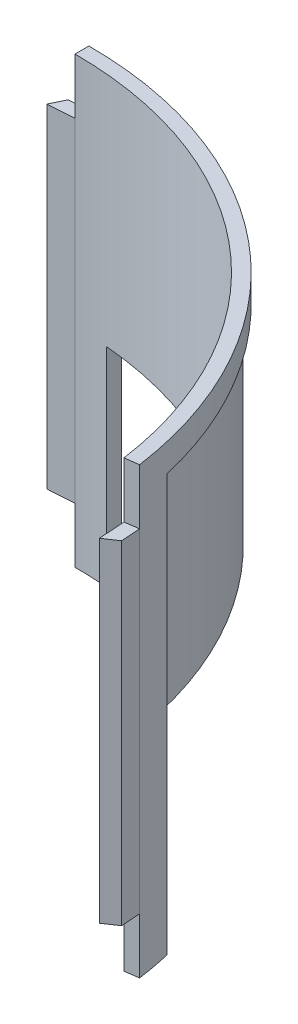
ISO-10303-21;
HEADER;
FILE_DESCRIPTION(('STEP AP214'),'2;1');
FILE_NAME('part.step','',(''),(''),'','','');
FILE_SCHEMA(('AUTOMOTIVE_DESIGN { 1 0 10303 214 1 1 1 1 }'));
ENDSEC;
DATA;
#1=APPLICATION_CONTEXT('core data for automotive mechanical design processes');
#2=APPLICATION_PROTOCOL_DEFINITION('international standard','automotive_design',2000,#1);
#3=PRODUCT_CONTEXT('',#1,'mechanical');
#4=PRODUCT('Part','Part','',(#3));
#5=PRODUCT_RELATED_PRODUCT_CATEGORY('part','',(#4));
#6=PRODUCT_DEFINITION_FORMATION('','',#4);
#7=PRODUCT_DEFINITION_CONTEXT('part definition',#1,'design');
#8=PRODUCT_DEFINITION('design','',#6,#7);
#9=PRODUCT_DEFINITION_SHAPE('','',#8);
#10=(LENGTH_UNIT() NAMED_UNIT(*) SI_UNIT(.MILLI.,.METRE.));
#11=(NAMED_UNIT(*) PLANE_ANGLE_UNIT() SI_UNIT($,.RADIAN.));
#12=(NAMED_UNIT(*) SI_UNIT($,.STERADIAN.) SOLID_ANGLE_UNIT());
#13=UNCERTAINTY_MEASURE_WITH_UNIT(LENGTH_MEASURE(1.E-05),#10,'distance_accuracy_value','');
#14=(GEOMETRIC_REPRESENTATION_CONTEXT(3) GLOBAL_UNCERTAINTY_ASSIGNED_CONTEXT((#13)) GLOBAL_UNIT_ASSIGNED_CONTEXT((#10,
#11,#12)) REPRESENTATION_CONTEXT('',''));
#15=CARTESIAN_POINT('',(0.,0.,0.));
#16=DIRECTION('',(0.,0.,1.));
#17=DIRECTION('',(1.,0.,0.));
#18=AXIS2_PLACEMENT_3D('',#15,#16,#17);
#19=CARTESIAN_POINT('',(0.,0.,0.));
#20=DIRECTION('',(0.,-1.,0.));
#21=DIRECTION('',(0.,0.,-1.));
#22=AXIS2_PLACEMENT_3D('',#19,#20,#21);
#23=PLANE('',#22);
#24=DIRECTION('',(0.0866014517586422,0.,-0.996243036890746));
#25=VECTOR('',#24,1.);
#26=CARTESIAN_POINT('',(61.0540234898431,0.,-702.351341007976));
#27=LINE('',#26,#25);
#28=CARTESIAN_POINT('',(58.888987195877,0.,-677.445265085707));
#29=VERTEX_POINT('',#28);
#30=CARTESIAN_POINT('',(61.0540234898431,0.,-702.351341007976));
#31=VERTEX_POINT('',#30);
#32=EDGE_CURVE('E306',#29,#31,#27,.T.);
#33=ORIENTED_EDGE('',*,*,#32,.F.);
#34=CARTESIAN_POINT('',(0.,0.,0.));
#35=DIRECTION('',(0.,-1.,0.));
#36=DIRECTION('',(0.,0.,-1.));
#37=AXIS2_PLACEMENT_3D('',#34,#35,#36);
#38=CIRCLE('',#37,680.);
#39=CARTESIAN_POINT('',(0.,0.,-680.));
#40=VERTEX_POINT('',#39);
#41=EDGE_CURVE('E277',#40,#29,#38,.T.);
#42=ORIENTED_EDGE('',*,*,#41,.F.);
#43=DIRECTION('',(0.,0.,1.));
#44=VECTOR('',#43,1.);
#45=CARTESIAN_POINT('',(0.,0.,-705.));
#46=LINE('',#45,#44);
#47=CARTESIAN_POINT('',(0.,0.,-705.));
#48=VERTEX_POINT('',#47);
#49=EDGE_CURVE('E273',#48,#40,#46,.T.);
#50=ORIENTED_EDGE('',*,*,#49,.F.);
#51=CARTESIAN_POINT('',(0.,0.,0.));
#52=DIRECTION('',(0.,1.,0.));
#53=DIRECTION('',(0.,0.,-1.));
#54=AXIS2_PLACEMENT_3D('',#51,#52,#53);
#55=CIRCLE('',#54,705.);
#56=EDGE_CURVE('E253',#31,#48,#55,.T.);
#57=ORIENTED_EDGE('',*,*,#56,.F.);
#58=EDGE_LOOP('',(#33,#42,#50,#57));
#59=FACE_BOUND('',#58,.T.);
#60=ADVANCED_FACE('F36',(#59),#23,.T.);
#61=CARTESIAN_POINT('',(0.,800.,-705.));
#62=DIRECTION('',(1.,0.,0.));
#63=DIRECTION('',(0.,0.,-1.));
#64=AXIS2_PLACEMENT_3D('',#61,#62,#63);
#65=PLANE('',#64);
#66=DIRECTION('',(0.,0.,-1.));
#67=VECTOR('',#66,1.);
#68=CARTESIAN_POINT('',(-1.67579190573702E-13,700.,-1.45674367899697E-13));
#69=LINE('',#68,#67);
#70=CARTESIAN_POINT('',(0.,700.,-680.));
#71=VERTEX_POINT('',#70);
#72=CARTESIAN_POINT('',(0.,700.,-705.));
#73=VERTEX_POINT('',#72);
#74=EDGE_CURVE('E188',#71,#73,#69,.T.);
#75=ORIENTED_EDGE('',*,*,#74,.F.);
#76=DIRECTION('',(0.,-1.,0.));
#77=VECTOR('',#76,1.);
#78=CARTESIAN_POINT('',(0.,800.,-680.));
#79=LINE('',#78,#77);
#80=CARTESIAN_POINT('',(0.,800.,-680.));
#81=VERTEX_POINT('',#80);
#82=EDGE_CURVE('E289',#81,#71,#79,.T.);
#83=ORIENTED_EDGE('',*,*,#82,.F.);
#84=DIRECTION('',(0.,0.,1.));
#85=VECTOR('',#84,1.);
#86=CARTESIAN_POINT('',(0.,800.,-705.));
#87=LINE('',#86,#85);
#88=CARTESIAN_POINT('',(0.,800.,-705.));
#89=VERTEX_POINT('',#88);
#90=EDGE_CURVE('E262',#89,#81,#87,.T.);
#91=ORIENTED_EDGE('',*,*,#90,.F.);
#92=DIRECTION('',(0.,-1.,0.));
#93=VECTOR('',#92,1.);
#94=CARTESIAN_POINT('',(0.,800.,-705.));
#95=LINE('',#94,#93);
#96=EDGE_CURVE('E11',#89,#73,#95,.T.);
#97=ORIENTED_EDGE('',*,*,#96,.T.);
#98=EDGE_LOOP('',(#75,#83,#91,#97));
#99=FACE_BOUND('',#98,.T.);
#100=ADVANCED_FACE('F359',(#99),#65,.F.);
#101=CARTESIAN_POINT('',(698.138988462807,800.,-98.1170361768489));
#102=DIRECTION('',(-0.139173100960069,0.,-0.99026806874157));
#103=DIRECTION('',(-0.99026806874157,0.,0.139173100960069));
#104=AXIS2_PLACEMENT_3D('',#101,#102,#103);
#105=PLANE('',#104);
#106=DIRECTION('',(0.99026806874157,0.,-0.13917310096007));
#107=VECTOR('',#106,1.);
#108=CARTESIAN_POINT('',(0.,700.,0.));
#109=LINE('',#108,#107);
#110=CARTESIAN_POINT('',(673.382286744267,700.,-94.6377086528472));
#111=VERTEX_POINT('',#110);
#112=CARTESIAN_POINT('',(698.138988462806,700.,-98.1170361768489));
#113=VERTEX_POINT('',#112);
#114=EDGE_CURVE('E213',#111,#113,#109,.T.);
#115=ORIENTED_EDGE('',*,*,#114,.T.);
#116=DIRECTION('',(0.,-1.,0.));
#117=VECTOR('',#116,1.);
#118=CARTESIAN_POINT('',(698.138988462807,800.,-98.1170361768489));
#119=LINE('',#118,#117);
#120=CARTESIAN_POINT('',(698.138988462807,800.,-98.1170361768489));
#121=VERTEX_POINT('',#120);
#122=EDGE_CURVE('E282',#121,#113,#119,.T.);
#123=ORIENTED_EDGE('',*,*,#122,.F.);
#124=DIRECTION('',(0.99026806874157,0.,-0.139173100960069));
#125=VECTOR('',#124,1.);
#126=CARTESIAN_POINT('',(698.138988462807,800.,-98.1170361768489));
#127=LINE('',#126,#125);
#128=CARTESIAN_POINT('',(673.382286744267,800.,-94.6377086528472));
#129=VERTEX_POINT('',#128);
#130=EDGE_CURVE('E267',#129,#121,#127,.T.);
#131=ORIENTED_EDGE('',*,*,#130,.F.);
#132=DIRECTION('',(0.,-1.,0.));
#133=VECTOR('',#132,1.);
#134=CARTESIAN_POINT('',(673.382286744267,800.,-94.6377086528472));
#135=LINE('',#134,#133);
#136=EDGE_CURVE('E286',#129,#111,#135,.T.);
#137=ORIENTED_EDGE('',*,*,#136,.T.);
#138=EDGE_LOOP('',(#115,#123,#131,#137));
#139=FACE_BOUND('',#138,.T.);
#140=ADVANCED_FACE('F352',(#139),#105,.F.);
#141=DIRECTION('',(0.99026806874157,0.,-0.13917310096007));
#142=VECTOR('',#141,1.);
#143=CARTESIAN_POINT('',(0.,100.,0.));
#144=LINE('',#143,#142);
#145=CARTESIAN_POINT('',(673.382286744267,100.,-94.6377086528472));
#146=VERTEX_POINT('',#145);
#147=CARTESIAN_POINT('',(698.138988462806,100.,-98.1170361768489));
#148=VERTEX_POINT('',#147);
#149=EDGE_CURVE('E59',#146,#148,#144,.T.);
#150=ORIENTED_EDGE('',*,*,#149,.F.);
#151=CARTESIAN_POINT('',(673.382286744267,0.,-94.6377086528472));
#152=VERTEX_POINT('',#151);
#153=EDGE_CURVE('E285',#146,#152,#135,.T.);
#154=ORIENTED_EDGE('',*,*,#153,.T.);
#155=DIRECTION('',(0.99026806874157,0.,-0.139173100960069));
#156=VECTOR('',#155,1.);
#157=CARTESIAN_POINT('',(698.138988462807,0.,-98.1170361768489));
#158=LINE('',#157,#156);
#159=CARTESIAN_POINT('',(698.138988462807,0.,-98.1170361768489));
#160=VERTEX_POINT('',#159);
#161=EDGE_CURVE('E263',#152,#160,#158,.T.);
#162=ORIENTED_EDGE('',*,*,#161,.T.);
#163=EDGE_CURVE('E269',#148,#160,#119,.T.);
#164=ORIENTED_EDGE('',*,*,#163,.F.);
#165=EDGE_LOOP('',(#150,#154,#162,#164));
#166=FACE_BOUND('',#165,.T.);
#167=ADVANCED_FACE('F334',(#166),#105,.F.);
#168=CARTESIAN_POINT('',(0.,800.,0.));
#169=DIRECTION('',(0.,-1.,0.));
#170=DIRECTION('',(0.,0.,-1.));
#171=AXIS2_PLACEMENT_3D('',#168,#169,#170);
#172=CYLINDRICAL_SURFACE('',#171,705.);
#173=CARTESIAN_POINT('',(687.019028262849,0.,-158.208264021733));
#174=VERTEX_POINT('',#173);
#175=EDGE_CURVE('E270',#160,#174,#55,.T.);
#176=ORIENTED_EDGE('',*,*,#175,.T.);
#177=DIRECTION('',(0.,-1.,0.));
#178=VECTOR('',#177,1.);
#179=CARTESIAN_POINT('',(687.019028262849,750.,-158.208264021733));
#180=LINE('',#179,#178);
#181=CARTESIAN_POINT('',(687.019028262849,750.,-158.208264021733));
#182=VERTEX_POINT('',#181);
#183=EDGE_CURVE('E189',#182,#174,#180,.T.);
#184=ORIENTED_EDGE('',*,*,#183,.F.);
#185=CARTESIAN_POINT('',(0.,750.,0.));
#186=DIRECTION('',(0.,-1.,0.));
#187=DIRECTION('',(0.,0.,-1.));
#188=AXIS2_PLACEMENT_3D('',#185,#186,#187);
#189=CIRCLE('',#188,705.);
#190=CARTESIAN_POINT('',(61.0540234898431,750.,-702.351341007976));
#191=VERTEX_POINT('',#190);
#192=EDGE_CURVE('E320',#191,#182,#189,.T.);
#193=ORIENTED_EDGE('',*,*,#192,.F.);
#194=DIRECTION('',(0.,-1.,0.));
#195=VECTOR('',#194,1.);
#196=CARTESIAN_POINT('',(61.0540234898431,750.,-702.351341007976));
#197=LINE('',#196,#195);
#198=EDGE_CURVE('E194',#191,#31,#197,.T.);
#199=ORIENTED_EDGE('',*,*,#198,.T.);
#200=ORIENTED_EDGE('',*,*,#56,.T.);
#201=CARTESIAN_POINT('',(0.,100.,-705.));
#202=VERTEX_POINT('',#201);
#203=EDGE_CURVE('E44',#202,#48,#95,.T.);
#204=ORIENTED_EDGE('',*,*,#203,.F.);
#205=DIRECTION('',(0.,1.,0.));
#206=VECTOR('',#205,1.);
#207=CARTESIAN_POINT('',(2.35922392732846E-13,100.,-705.));
#208=LINE('',#207,#206);
#209=EDGE_CURVE('E233',#202,#73,#208,.T.);
#210=ORIENTED_EDGE('',*,*,#209,.T.);
#211=ORIENTED_EDGE('',*,*,#96,.F.);
#212=CARTESIAN_POINT('',(0.,800.,0.));
#213=DIRECTION('',(0.,1.,0.));
#214=DIRECTION('',(0.,0.,-1.));
#215=AXIS2_PLACEMENT_3D('',#212,#213,#214);
#216=CIRCLE('',#215,705.);
#217=EDGE_CURVE('E259',#121,#89,#216,.T.);
#218=ORIENTED_EDGE('',*,*,#217,.F.);
#219=ORIENTED_EDGE('',*,*,#122,.T.);
#220=DIRECTION('',(0.,1.,0.));
#221=VECTOR('',#220,1.);
#222=CARTESIAN_POINT('',(698.138988462806,100.,-98.1170361768489));
#223=LINE('',#222,#221);
#224=EDGE_CURVE('E251',#148,#113,#223,.T.);
#225=ORIENTED_EDGE('',*,*,#224,.F.);
#226=ORIENTED_EDGE('',*,*,#163,.T.);
#227=EDGE_LOOP('',(#176,#184,#193,#199,#200,#204,#210,#211,#218,#219,#225,#226));
#228=FACE_BOUND('',#227,.T.);
#229=ADVANCED_FACE('F38',(#228),#172,.T.);
#230=CARTESIAN_POINT('',(1.94289029309402E-13,100.,-680.));
#231=VERTEX_POINT('',#230);
#232=EDGE_CURVE('E288',#231,#40,#79,.T.);
#233=ORIENTED_EDGE('',*,*,#232,.F.);
#234=DIRECTION('',(0.,0.,-1.));
#235=VECTOR('',#234,1.);
#236=CARTESIAN_POINT('',(0.,100.,0.));
#237=LINE('',#236,#235);
#238=EDGE_CURVE('E225',#231,#202,#237,.T.);
#239=ORIENTED_EDGE('',*,*,#238,.T.);
#240=ORIENTED_EDGE('',*,*,#203,.T.);
#241=ORIENTED_EDGE('',*,*,#49,.T.);
#242=EDGE_LOOP('',(#233,#239,#240,#241));
#243=FACE_BOUND('',#242,.T.);
#244=ADVANCED_FACE('F302',(#243),#65,.F.);
#245=CARTESIAN_POINT('',(0.,800.,0.));
#246=DIRECTION('',(0.,-1.,0.));
#247=DIRECTION('',(0.,0.,-1.));
#248=AXIS2_PLACEMENT_3D('',#245,#246,#247);
#249=CYLINDRICAL_SURFACE('',#248,680.);
#250=ORIENTED_EDGE('',*,*,#41,.T.);
#251=DIRECTION('',(0.,-1.,0.));
#252=VECTOR('',#251,1.);
#253=CARTESIAN_POINT('',(58.888987195877,375.,-677.445265085707));
#254=LINE('',#253,#252);
#255=CARTESIAN_POINT('',(58.888987195877,375.,-677.445265085707));
#256=VERTEX_POINT('',#255);
#257=EDGE_CURVE('E309',#256,#29,#254,.T.);
#258=ORIENTED_EDGE('',*,*,#257,.F.);
#259=CARTESIAN_POINT('',(0.,375.,0.));
#260=DIRECTION('',(0.,1.,0.));
#261=DIRECTION('',(0.,0.,-1.));
#262=AXIS2_PLACEMENT_3D('',#259,#260,#261);
#263=CIRCLE('',#262,680.);
#264=CARTESIAN_POINT('',(662.656651374096,375.,-152.598041893302));
#265=VERTEX_POINT('',#264);
#266=EDGE_CURVE('E174',#265,#256,#263,.T.);
#267=ORIENTED_EDGE('',*,*,#266,.F.);
#268=DIRECTION('',(0.,-1.,0.));
#269=VECTOR('',#268,1.);
#270=CARTESIAN_POINT('',(662.656651374096,375.,-152.598041893302));
#271=LINE('',#270,#269);
#272=CARTESIAN_POINT('',(662.656651374096,0.,-152.598041893302));
#273=VERTEX_POINT('',#272);
#274=EDGE_CURVE('E171',#265,#273,#271,.T.);
#275=ORIENTED_EDGE('',*,*,#274,.T.);
#276=EDGE_CURVE('E276',#273,#152,#38,.T.);
#277=ORIENTED_EDGE('',*,*,#276,.T.);
#278=ORIENTED_EDGE('',*,*,#153,.F.);
#279=DIRECTION('',(0.,1.,0.));
#280=VECTOR('',#279,1.);
#281=CARTESIAN_POINT('',(673.382286744267,100.,-94.6377086528472));
#282=LINE('',#281,#280);
#283=EDGE_CURVE('E250',#146,#111,#282,.T.);
#284=ORIENTED_EDGE('',*,*,#283,.T.);
#285=ORIENTED_EDGE('',*,*,#136,.F.);
#286=CARTESIAN_POINT('',(0.,800.,0.));
#287=DIRECTION('',(0.,-1.,0.));
#288=DIRECTION('',(0.,0.,-1.));
#289=AXIS2_PLACEMENT_3D('',#286,#287,#288);
#290=CIRCLE('',#289,680.);
#291=EDGE_CURVE('E265',#81,#129,#290,.T.);
#292=ORIENTED_EDGE('',*,*,#291,.F.);
#293=ORIENTED_EDGE('',*,*,#82,.T.);
#294=DIRECTION('',(0.,1.,0.));
#295=VECTOR('',#294,1.);
#296=CARTESIAN_POINT('',(1.94289029309402E-13,100.,-680.));
#297=LINE('',#296,#295);
#298=EDGE_CURVE('E234',#231,#71,#297,.T.);
#299=ORIENTED_EDGE('',*,*,#298,.F.);
#300=ORIENTED_EDGE('',*,*,#232,.T.);
#301=EDGE_LOOP('',(#250,#258,#267,#275,#277,#278,#284,#285,#292,#293,#299,#300));
#302=FACE_BOUND('',#301,.T.);
#303=ADVANCED_FACE('F297',(#302),#249,.F.);
#304=CARTESIAN_POINT('',(0.,800.,0.));
#305=DIRECTION('',(0.,-1.,0.));
#306=DIRECTION('',(0.,0.,-1.));
#307=AXIS2_PLACEMENT_3D('',#304,#305,#306);
#308=PLANE('',#307);
#309=ORIENTED_EDGE('',*,*,#217,.T.);
#310=ORIENTED_EDGE('',*,*,#90,.T.);
#311=ORIENTED_EDGE('',*,*,#291,.T.);
#312=ORIENTED_EDGE('',*,*,#130,.T.);
#313=EDGE_LOOP('',(#309,#310,#311,#312));
#314=FACE_BOUND('',#313,.T.);
#315=ADVANCED_FACE('F355',(#314),#308,.F.);
#316=ORIENTED_EDGE('',*,*,#276,.F.);
#317=DIRECTION('',(-0.974495075550141,0.,0.224408885137209));
#318=VECTOR('',#317,1.);
#319=CARTESIAN_POINT('',(677.274077507348,0.,-155.964175170361));
#320=LINE('',#319,#318);
#321=EDGE_CURVE('E197',#174,#273,#320,.T.);
#322=ORIENTED_EDGE('',*,*,#321,.F.);
#323=ORIENTED_EDGE('',*,*,#175,.F.);
#324=ORIENTED_EDGE('',*,*,#161,.F.);
#325=EDGE_LOOP('',(#316,#322,#323,#324));
#326=FACE_BOUND('',#325,.T.);
#327=ADVANCED_FACE('F332',(#326),#23,.T.);
#328=CARTESIAN_POINT('',(701.569494231403,100.,-49.0585180884084));
#329=DIRECTION('',(-0.997564050259826,0.,0.0697564737441046));
#330=DIRECTION('',(0.0697564737441046,0.,0.997564050259826));
#331=AXIS2_PLACEMENT_3D('',#328,#329,#330);
#332=PLANE('',#331);
#333=ORIENTED_EDGE('',*,*,#224,.T.);
#334=DIRECTION('',(0.0697564737441046,0.,0.997564050259826));
#335=VECTOR('',#334,1.);
#336=CARTESIAN_POINT('',(701.569494231403,700.,-49.0585180884084));
#337=LINE('',#336,#335);
#338=CARTESIAN_POINT('',(700.565098890112,700.,-63.4220406540098));
#339=VERTEX_POINT('',#338);
#340=EDGE_CURVE('E216',#113,#339,#337,.T.);
#341=ORIENTED_EDGE('',*,*,#340,.T.);
#342=DIRECTION('',(0.,1.,0.));
#343=VECTOR('',#342,1.);
#344=CARTESIAN_POINT('',(700.565098890112,100.,-63.4220406540098));
#345=LINE('',#344,#343);
#346=CARTESIAN_POINT('',(700.565098890112,100.,-63.4220406540098));
#347=VERTEX_POINT('',#346);
#348=EDGE_CURVE('E254',#347,#339,#345,.T.);
#349=ORIENTED_EDGE('',*,*,#348,.F.);
#350=DIRECTION('',(0.0697564737441046,0.,0.997564050259826));
#351=VECTOR('',#350,1.);
#352=CARTESIAN_POINT('',(701.569494231403,100.,-49.0585180884084));
#353=LINE('',#352,#351);
#354=EDGE_CURVE('E248',#148,#347,#353,.T.);
#355=ORIENTED_EDGE('',*,*,#354,.F.);
#356=EDGE_LOOP('',(#333,#341,#349,#355));
#357=FACE_BOUND('',#356,.T.);
#358=ADVANCED_FACE('F338',(#357),#332,.F.);
#359=CARTESIAN_POINT('',(189.662450805355,100.,281.186146756497));
#360=DIRECTION('',(0.559192903470734,0.,0.82903757255505));
#361=DIRECTION('',(0.82903757255505,0.,-0.559192903470734));
#362=AXIS2_PLACEMENT_3D('',#359,#360,#361);
#363=PLANE('',#362);
#364=ORIENTED_EDGE('',*,*,#348,.T.);
#365=DIRECTION('',(0.82903757255505,0.,-0.559192903470734));
#366=VECTOR('',#365,1.);
#367=CARTESIAN_POINT('',(189.662450805355,700.,281.186146756497));
#368=LINE('',#367,#366);
#369=CARTESIAN_POINT('',(676.691143372133,700.,-47.3188543264161));
#370=VERTEX_POINT('',#369);
#371=EDGE_CURVE('E219',#370,#339,#368,.T.);
#372=ORIENTED_EDGE('',*,*,#371,.F.);
#373=DIRECTION('',(0.,1.,0.));
#374=VECTOR('',#373,1.);
#375=CARTESIAN_POINT('',(676.691143372133,100.,-47.3188543264161));
#376=LINE('',#375,#374);
#377=CARTESIAN_POINT('',(676.691143372133,100.,-47.3188543264161));
#378=VERTEX_POINT('',#377);
#379=EDGE_CURVE('E256',#378,#370,#376,.T.);
#380=ORIENTED_EDGE('',*,*,#379,.F.);
#381=DIRECTION('',(0.82903757255505,0.,-0.559192903470734));
#382=VECTOR('',#381,1.);
#383=CARTESIAN_POINT('',(189.662450805355,100.,281.186146756497));
#384=LINE('',#383,#382);
#385=EDGE_CURVE('E245',#378,#347,#384,.T.);
#386=ORIENTED_EDGE('',*,*,#385,.T.);
#387=EDGE_LOOP('',(#364,#372,#380,#386));
#388=FACE_BOUND('',#387,.T.);
#389=ADVANCED_FACE('F398',(#388),#363,.T.);
#390=CARTESIAN_POINT('',(676.691143372134,100.,-47.3188543264082));
#391=DIRECTION('',(-0.997564050259826,0.,0.0697564737441047));
#392=DIRECTION('',(0.0697564737441047,0.,0.997564050259826));
#393=AXIS2_PLACEMENT_3D('',#390,#391,#392);
#394=PLANE('',#393);
#395=ORIENTED_EDGE('',*,*,#379,.T.);
#396=DIRECTION('',(0.0697564737441047,0.,0.997564050259826));
#397=VECTOR('',#396,1.);
#398=CARTESIAN_POINT('',(676.691143372134,700.,-47.3188543264082));
#399=LINE('',#398,#397);
#400=EDGE_CURVE('E222',#111,#370,#399,.T.);
#401=ORIENTED_EDGE('',*,*,#400,.F.);
#402=ORIENTED_EDGE('',*,*,#283,.F.);
#403=DIRECTION('',(0.0697564737441047,0.,0.997564050259826));
#404=VECTOR('',#403,1.);
#405=CARTESIAN_POINT('',(676.691143372134,100.,-47.3188543264082));
#406=LINE('',#405,#404);
#407=EDGE_CURVE('E242',#146,#378,#406,.T.);
#408=ORIENTED_EDGE('',*,*,#407,.T.);
#409=EDGE_LOOP('',(#395,#401,#402,#408));
#410=FACE_BOUND('',#409,.T.);
#411=ADVANCED_FACE('F345',(#410),#394,.T.);
#412=CARTESIAN_POINT('',(0.,100.,0.));
#413=DIRECTION('',(0.,1.,0.));
#414=DIRECTION('',(0.,0.,1.));
#415=AXIS2_PLACEMENT_3D('',#412,#413,#414);
#416=PLANE('',#415);
#417=ORIENTED_EDGE('',*,*,#149,.T.);
#418=ORIENTED_EDGE('',*,*,#354,.T.);
#419=ORIENTED_EDGE('',*,*,#385,.F.);
#420=ORIENTED_EDGE('',*,*,#407,.F.);
#421=EDGE_LOOP('',(#417,#418,#419,#420));
#422=FACE_BOUND('',#421,.T.);
#423=ADVANCED_FACE('F343',(#422),#416,.F.);
#424=CARTESIAN_POINT('',(-47.3188543264387,100.,-676.691143372131));
#425=DIRECTION('',(-0.069756473744149,0.,-0.997564050259823));
#426=DIRECTION('',(-0.997564050259823,0.,0.0697564737441491));
#427=AXIS2_PLACEMENT_3D('',#424,#425,#426);
#428=PLANE('',#427);
#429=DIRECTION('',(-0.997564050259823,0.,0.0697564737441491));
#430=VECTOR('',#429,1.);
#431=CARTESIAN_POINT('',(-47.3188543264388,700.,-676.691143372132));
#432=LINE('',#431,#430);
#433=CARTESIAN_POINT('',(-47.3188543264309,700.,-676.691143372132));
#434=VERTEX_POINT('',#433);
#435=EDGE_CURVE('E192',#71,#434,#432,.T.);
#436=ORIENTED_EDGE('',*,*,#435,.T.);
#437=DIRECTION('',(0.,1.,0.));
#438=VECTOR('',#437,1.);
#439=CARTESIAN_POINT('',(-47.3188543264308,100.,-676.691143372132));
#440=LINE('',#439,#438);
#441=CARTESIAN_POINT('',(-47.3188543264308,100.,-676.691143372132));
#442=VERTEX_POINT('',#441);
#443=EDGE_CURVE('E236',#442,#434,#440,.T.);
#444=ORIENTED_EDGE('',*,*,#443,.F.);
#445=DIRECTION('',(-0.997564050259823,0.,0.0697564737441491));
#446=VECTOR('',#445,1.);
#447=CARTESIAN_POINT('',(-47.3188543264387,100.,-676.691143372131));
#448=LINE('',#447,#446);
#449=EDGE_CURVE('E231',#231,#442,#448,.T.);
#450=ORIENTED_EDGE('',*,*,#449,.F.);
#451=ORIENTED_EDGE('',*,*,#298,.T.);
#452=EDGE_LOOP('',(#436,#444,#450,#451));
#453=FACE_BOUND('',#452,.T.);
#454=ADVANCED_FACE('F367',(#453),#428,.F.);
#455=CARTESIAN_POINT('',(-304.845573919707,100.,-148.683120880698));
#456=DIRECTION('',(0.898794046299175,0.,0.438371146789061));
#457=DIRECTION('',(0.438371146789061,0.,-0.898794046299175));
#458=AXIS2_PLACEMENT_3D('',#455,#456,#457);
#459=PLANE('',#458);
#460=DIRECTION('',(0.43837114678906,0.,-0.898794046299175));
#461=VECTOR('',#460,1.);
#462=CARTESIAN_POINT('',(-304.845573919708,700.,-148.683120880698));
#463=LINE('',#462,#461);
#464=CARTESIAN_POINT('',(-34.694995522839,700.,-702.573889572692));
#465=VERTEX_POINT('',#464);
#466=EDGE_CURVE('E207',#434,#465,#463,.T.);
#467=ORIENTED_EDGE('',*,*,#466,.T.);
#468=DIRECTION('',(0.,1.,0.));
#469=VECTOR('',#468,1.);
#470=CARTESIAN_POINT('',(-34.6949955228388,100.,-702.573889572692));
#471=LINE('',#470,#469);
#472=CARTESIAN_POINT('',(-34.6949955228388,100.,-702.573889572692));
#473=VERTEX_POINT('',#472);
#474=EDGE_CURVE('E238',#473,#465,#471,.T.);
#475=ORIENTED_EDGE('',*,*,#474,.F.);
#476=DIRECTION('',(0.43837114678906,0.,-0.898794046299175));
#477=VECTOR('',#476,1.);
#478=CARTESIAN_POINT('',(-304.845573919707,100.,-148.683120880698));
#479=LINE('',#478,#477);
#480=EDGE_CURVE('E229',#442,#473,#479,.T.);
#481=ORIENTED_EDGE('',*,*,#480,.F.);
#482=ORIENTED_EDGE('',*,*,#443,.T.);
#483=EDGE_LOOP('',(#467,#475,#481,#482));
#484=FACE_BOUND('',#483,.T.);
#485=ADVANCED_FACE('F375',(#484),#459,.F.);
#486=CARTESIAN_POINT('',(-49.0585180884402,100.,-701.569494231401));
#487=DIRECTION('',(-0.0697564737441492,0.,-0.997564050259823));
#488=DIRECTION('',(-0.997564050259823,0.,0.0697564737441492));
#489=AXIS2_PLACEMENT_3D('',#486,#487,#488);
#490=PLANE('',#489);
#491=DIRECTION('',(-0.997564050259823,0.,0.0697564737441492));
#492=VECTOR('',#491,1.);
#493=CARTESIAN_POINT('',(-49.0585180884403,700.,-701.569494231401));
#494=LINE('',#493,#492);
#495=EDGE_CURVE('E210',#73,#465,#494,.T.);
#496=ORIENTED_EDGE('',*,*,#495,.F.);
#497=ORIENTED_EDGE('',*,*,#209,.F.);
#498=DIRECTION('',(-0.997564050259823,0.,0.0697564737441492));
#499=VECTOR('',#498,1.);
#500=CARTESIAN_POINT('',(-49.0585180884402,100.,-701.569494231401));
#501=LINE('',#500,#499);
#502=EDGE_CURVE('E51',#202,#473,#501,.T.);
#503=ORIENTED_EDGE('',*,*,#502,.T.);
#504=ORIENTED_EDGE('',*,*,#474,.T.);
#505=EDGE_LOOP('',(#496,#497,#503,#504));
#506=FACE_BOUND('',#505,.T.);
#507=ADVANCED_FACE('F372',(#506),#490,.T.);
#508=CARTESIAN_POINT('',(0.,100.,0.));
#509=DIRECTION('',(0.,1.,0.));
#510=DIRECTION('',(-0.99026806874157,0.,0.139173100960069));
#511=AXIS2_PLACEMENT_3D('',#508,#509,#510);
#512=PLANE('',#511);
#513=ORIENTED_EDGE('',*,*,#238,.F.);
#514=ORIENTED_EDGE('',*,*,#449,.T.);
#515=ORIENTED_EDGE('',*,*,#480,.T.);
#516=ORIENTED_EDGE('',*,*,#502,.F.);
#517=EDGE_LOOP('',(#513,#514,#515,#516));
#518=FACE_BOUND('',#517,.T.);
#519=ADVANCED_FACE('F369',(#518),#512,.F.);
#520=CARTESIAN_POINT('',(0.,700.,0.));
#521=DIRECTION('',(0.,-1.,0.));
#522=DIRECTION('',(0.,0.,1.));
#523=AXIS2_PLACEMENT_3D('',#520,#521,#522);
#524=PLANE('',#523);
#525=ORIENTED_EDGE('',*,*,#114,.F.);
#526=ORIENTED_EDGE('',*,*,#400,.T.);
#527=ORIENTED_EDGE('',*,*,#371,.T.);
#528=ORIENTED_EDGE('',*,*,#340,.F.);
#529=EDGE_LOOP('',(#525,#526,#527,#528));
#530=FACE_BOUND('',#529,.T.);
#531=ADVANCED_FACE('F449',(#530),#524,.F.);
#532=CARTESIAN_POINT('',(-1.67579190573702E-13,700.,-1.45674367899697E-13));
#533=DIRECTION('',(0.,-1.,0.));
#534=DIRECTION('',(-0.99026806874157,0.,0.139173100960069));
#535=AXIS2_PLACEMENT_3D('',#532,#533,#534);
#536=PLANE('',#535);
#537=ORIENTED_EDGE('',*,*,#74,.T.);
#538=ORIENTED_EDGE('',*,*,#495,.T.);
#539=ORIENTED_EDGE('',*,*,#466,.F.);
#540=ORIENTED_EDGE('',*,*,#435,.F.);
#541=EDGE_LOOP('',(#537,#538,#539,#540));
#542=FACE_BOUND('',#541,.T.);
#543=ADVANCED_FACE('F362',(#542),#536,.F.);
#544=CARTESIAN_POINT('',(0.,750.,0.));
#545=DIRECTION('',(0.,-1.,0.));
#546=DIRECTION('',(0.,0.,-1.));
#547=AXIS2_PLACEMENT_3D('',#544,#545,#546);
#548=CYLINDRICAL_SURFACE('',#547,695.);
#549=DIRECTION('',(0.,-1.,0.));
#550=VECTOR('',#549,1.);
#551=CARTESIAN_POINT('',(677.274077507348,750.,-155.964175170361));
#552=LINE('',#551,#550);
#553=CARTESIAN_POINT('',(677.274077507348,750.,-155.964175170361));
#554=VERTEX_POINT('',#553);
#555=CARTESIAN_POINT('',(677.274077507348,375.,-155.964175170361));
#556=VERTEX_POINT('',#555);
#557=EDGE_CURVE('E168',#554,#556,#552,.T.);
#558=ORIENTED_EDGE('',*,*,#557,.T.);
#559=CARTESIAN_POINT('',(0.,375.,0.));
#560=DIRECTION('',(0.,-1.,0.));
#561=DIRECTION('',(0.,0.,1.));
#562=AXIS2_PLACEMENT_3D('',#559,#560,#561);
#563=CIRCLE('',#562,695.);
#564=CARTESIAN_POINT('',(60.1880089722567,375.,-692.388910639068));
#565=VERTEX_POINT('',#564);
#566=EDGE_CURVE('E175',#565,#556,#563,.T.);
#567=ORIENTED_EDGE('',*,*,#566,.F.);
#568=DIRECTION('',(0.,-1.,0.));
#569=VECTOR('',#568,1.);
#570=CARTESIAN_POINT('',(60.1880089722567,750.,-692.388910639068));
#571=LINE('',#570,#569);
#572=CARTESIAN_POINT('',(60.1880089722567,750.,-692.388910639068));
#573=VERTEX_POINT('',#572);
#574=EDGE_CURVE('E202',#573,#565,#571,.T.);
#575=ORIENTED_EDGE('',*,*,#574,.F.);
#576=CARTESIAN_POINT('',(0.,750.,0.));
#577=DIRECTION('',(0.,1.,0.));
#578=DIRECTION('',(0.,0.,-1.));
#579=AXIS2_PLACEMENT_3D('',#576,#577,#578);
#580=CIRCLE('',#579,695.);
#581=EDGE_CURVE('E186',#554,#573,#580,.T.);
#582=ORIENTED_EDGE('',*,*,#581,.F.);
#583=EDGE_LOOP('',(#558,#567,#575,#582));
#584=FACE_BOUND('',#583,.T.);
#585=ADVANCED_FACE('F184',(#584),#548,.T.);
#586=CARTESIAN_POINT('',(677.274077507348,750.,-155.964175170361));
#587=DIRECTION('',(0.224408885137209,0.,0.974495075550141));
#588=DIRECTION('',(0.974495075550141,0.,-0.224408885137209));
#589=AXIS2_PLACEMENT_3D('',#586,#587,#588);
#590=PLANE('',#589);
#591=ORIENTED_EDGE('',*,*,#321,.T.);
#592=ORIENTED_EDGE('',*,*,#274,.F.);
#593=DIRECTION('',(-0.974495075550141,0.,0.22440888513721));
#594=VECTOR('',#593,1.);
#595=CARTESIAN_POINT('',(677.274077507348,375.,-155.964175170361));
#596=LINE('',#595,#594);
#597=EDGE_CURVE('E163',#556,#265,#596,.T.);
#598=ORIENTED_EDGE('',*,*,#597,.F.);
#599=ORIENTED_EDGE('',*,*,#557,.F.);
#600=DIRECTION('',(-0.974495075550141,0.,0.224408885137209));
#601=VECTOR('',#600,1.);
#602=CARTESIAN_POINT('',(677.274077507348,750.,-155.964175170361));
#603=LINE('',#602,#601);
#604=EDGE_CURVE('E203',#182,#554,#603,.T.);
#605=ORIENTED_EDGE('',*,*,#604,.F.);
#606=ORIENTED_EDGE('',*,*,#183,.T.);
#607=EDGE_LOOP('',(#591,#592,#598,#599,#605,#606));
#608=FACE_BOUND('',#607,.T.);
#609=ADVANCED_FACE('F165',(#608),#590,.F.);
#610=CARTESIAN_POINT('',(61.0540234898431,750.,-702.351341007976));
#611=DIRECTION('',(-0.996243036890746,0.,-0.0866014517586422));
#612=DIRECTION('',(-0.0866014517586422,0.,0.996243036890746));
#613=AXIS2_PLACEMENT_3D('',#610,#611,#612);
#614=PLANE('',#613);
#615=ORIENTED_EDGE('',*,*,#32,.T.);
#616=ORIENTED_EDGE('',*,*,#198,.F.);
#617=DIRECTION('',(0.0866014517586422,0.,-0.996243036890746));
#618=VECTOR('',#617,1.);
#619=CARTESIAN_POINT('',(61.0540234898431,750.,-702.351341007976));
#620=LINE('',#619,#618);
#621=EDGE_CURVE('E317',#573,#191,#620,.T.);
#622=ORIENTED_EDGE('',*,*,#621,.F.);
#623=ORIENTED_EDGE('',*,*,#574,.T.);
#624=DIRECTION('',(0.0866014517586405,0.,-0.996243036890746));
#625=VECTOR('',#624,1.);
#626=CARTESIAN_POINT('',(60.1880089722567,375.,-692.388910639068));
#627=LINE('',#626,#625);
#628=EDGE_CURVE('E180',#256,#565,#627,.T.);
#629=ORIENTED_EDGE('',*,*,#628,.F.);
#630=ORIENTED_EDGE('',*,*,#257,.T.);
#631=EDGE_LOOP('',(#615,#616,#622,#623,#629,#630));
#632=FACE_BOUND('',#631,.T.);
#633=ADVANCED_FACE('F310',(#632),#614,.F.);
#634=CARTESIAN_POINT('',(0.,750.,0.));
#635=DIRECTION('',(0.,-1.,0.));
#636=DIRECTION('',(0.,0.,-1.));
#637=AXIS2_PLACEMENT_3D('',#634,#635,#636);
#638=PLANE('',#637);
#639=ORIENTED_EDGE('',*,*,#581,.T.);
#640=ORIENTED_EDGE('',*,*,#621,.T.);
#641=ORIENTED_EDGE('',*,*,#192,.T.);
#642=ORIENTED_EDGE('',*,*,#604,.T.);
#643=EDGE_LOOP('',(#639,#640,#641,#642));
#644=FACE_BOUND('',#643,.T.);
#645=ADVANCED_FACE('F323',(#644),#638,.T.);
#646=CARTESIAN_POINT('',(0.,375.,0.));
#647=DIRECTION('',(0.,1.,0.));
#648=DIRECTION('',(0.,0.,1.));
#649=AXIS2_PLACEMENT_3D('',#646,#647,#648);
#650=PLANE('',#649);
#651=ORIENTED_EDGE('',*,*,#566,.T.);
#652=ORIENTED_EDGE('',*,*,#597,.T.);
#653=ORIENTED_EDGE('',*,*,#266,.T.);
#654=ORIENTED_EDGE('',*,*,#628,.T.);
#655=EDGE_LOOP('',(#651,#652,#653,#654));
#656=FACE_BOUND('',#655,.T.);
#657=ADVANCED_FACE('F178',(#656),#650,.F.);
#658=CLOSED_SHELL('',(#60,#100,#140,#167,#229,#244,#303,#315,#327,#358,#389,#411,#423,#454,#485,
#507,#519,#531,#543,#585,#609,#633,#645,#657));
#659=MANIFOLD_SOLID_BREP('B2',#658);
#660=ADVANCED_BREP_SHAPE_REPRESENTATION('',(#18,#659),#14);
#661=SHAPE_DEFINITION_REPRESENTATION(#9,#660);
ENDSEC;
END-ISO-10303-21;
